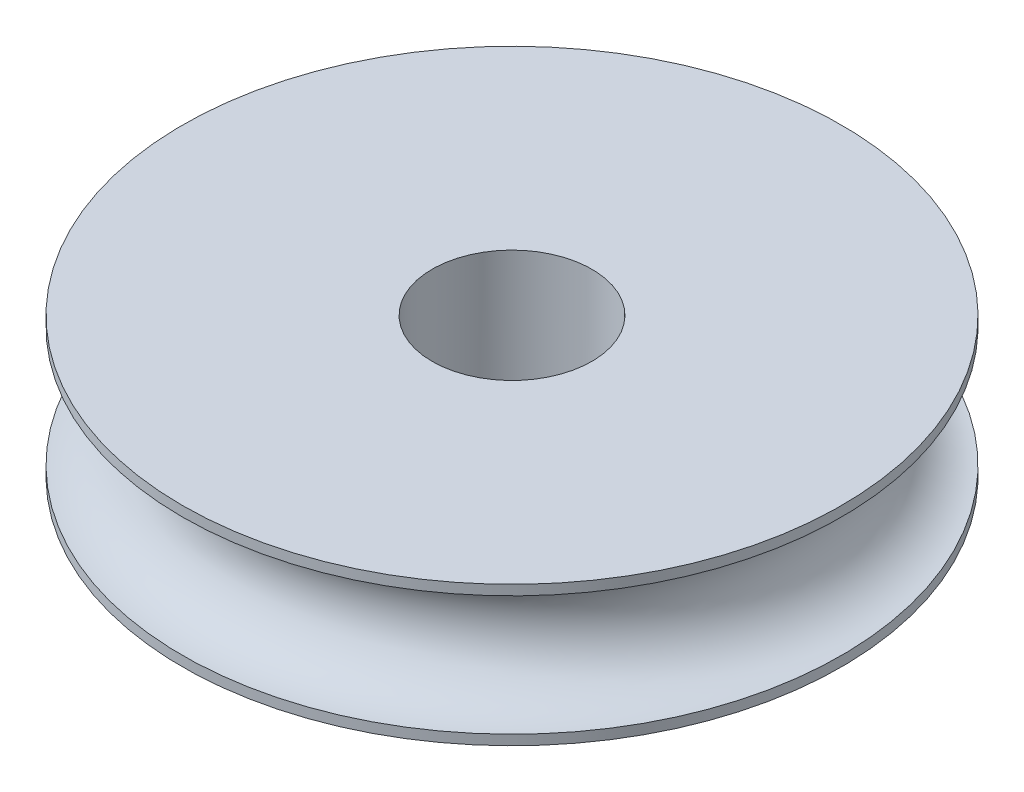
ISO-10303-21;
HEADER;
FILE_DESCRIPTION(('STEP AP214'),'2;1');
FILE_NAME('part.step','',(''),(''),'','','');
FILE_SCHEMA(('AUTOMOTIVE_DESIGN { 1 0 10303 214 1 1 1 1 }'));
ENDSEC;
DATA;
#1=APPLICATION_CONTEXT('core data for automotive mechanical design processes');
#2=APPLICATION_PROTOCOL_DEFINITION('international standard','automotive_design',2000,#1);
#3=PRODUCT_CONTEXT('',#1,'mechanical');
#4=PRODUCT('Part','Part','',(#3));
#5=PRODUCT_RELATED_PRODUCT_CATEGORY('part','',(#4));
#6=PRODUCT_DEFINITION_FORMATION('','',#4);
#7=PRODUCT_DEFINITION_CONTEXT('part definition',#1,'design');
#8=PRODUCT_DEFINITION('design','',#6,#7);
#9=PRODUCT_DEFINITION_SHAPE('','',#8);
#10=(LENGTH_UNIT() NAMED_UNIT(*) SI_UNIT(.MILLI.,.METRE.));
#11=(NAMED_UNIT(*) PLANE_ANGLE_UNIT() SI_UNIT($,.RADIAN.));
#12=(NAMED_UNIT(*) SI_UNIT($,.STERADIAN.) SOLID_ANGLE_UNIT());
#13=UNCERTAINTY_MEASURE_WITH_UNIT(LENGTH_MEASURE(1.E-05),#10,'distance_accuracy_value','');
#14=(GEOMETRIC_REPRESENTATION_CONTEXT(3) GLOBAL_UNCERTAINTY_ASSIGNED_CONTEXT((#13)) GLOBAL_UNIT_ASSIGNED_CONTEXT((#10,
#11,#12)) REPRESENTATION_CONTEXT('',''));
#15=CARTESIAN_POINT('',(0.,0.,0.));
#16=DIRECTION('',(0.,0.,1.));
#17=DIRECTION('',(1.,0.,0.));
#18=AXIS2_PLACEMENT_3D('',#15,#16,#17);
#19=CARTESIAN_POINT('',(0.,3.,0.));
#20=DIRECTION('',(0.,-1.,0.));
#21=DIRECTION('',(0.,0.,-1.));
#22=AXIS2_PLACEMENT_3D('',#19,#20,#21);
#23=TOROIDAL_SURFACE('',#22,16.5,3.);
#24=CARTESIAN_POINT('',(0.,0.,0.));
#25=DIRECTION('',(0.,-1.,0.));
#26=DIRECTION('',(0.,0.,-1.));
#27=AXIS2_PLACEMENT_3D('',#24,#25,#26);
#28=CIRCLE('',#27,16.5);
#29=CARTESIAN_POINT('',(0.,0.,-16.5));
#30=VERTEX_POINT('',#29);
#31=EDGE_CURVE('E10',#30,#30,#28,.T.);
#32=ORIENTED_EDGE('',*,*,#31,.F.);
#33=EDGE_LOOP('',(#32));
#34=FACE_BOUND('',#33,.T.);
#35=CARTESIAN_POINT('',(0.,6.,0.));
#36=DIRECTION('',(0.,1.,0.));
#37=DIRECTION('',(0.,0.,1.));
#38=AXIS2_PLACEMENT_3D('',#35,#36,#37);
#39=CIRCLE('',#38,16.5);
#40=CARTESIAN_POINT('',(0.,6.,16.5));
#41=VERTEX_POINT('',#40);
#42=EDGE_CURVE('E46',#41,#41,#39,.T.);
#43=ORIENTED_EDGE('',*,*,#42,.F.);
#44=EDGE_LOOP('',(#43));
#45=FACE_BOUND('',#44,.T.);
#46=ADVANCED_FACE('F35',(#34,#45),#23,.F.);
#47=CARTESIAN_POINT('',(0.,6.5,0.));
#48=DIRECTION('',(0.,-1.,0.));
#49=DIRECTION('',(0.,0.,-1.));
#50=AXIS2_PLACEMENT_3D('',#47,#48,#49);
#51=CYLINDRICAL_SURFACE('',#50,16.5);
#52=CARTESIAN_POINT('',(0.,6.5,0.));
#53=DIRECTION('',(0.,1.,0.));
#54=DIRECTION('',(0.,0.,1.));
#55=AXIS2_PLACEMENT_3D('',#52,#53,#54);
#56=CIRCLE('',#55,16.5);
#57=CARTESIAN_POINT('',(0.,6.5,16.5));
#58=VERTEX_POINT('',#57);
#59=EDGE_CURVE('E42',#58,#58,#56,.T.);
#60=ORIENTED_EDGE('',*,*,#59,.F.);
#61=EDGE_LOOP('',(#60));
#62=FACE_BOUND('',#61,.T.);
#63=ORIENTED_EDGE('',*,*,#42,.T.);
#64=EDGE_LOOP('',(#63));
#65=FACE_BOUND('',#64,.T.);
#66=ADVANCED_FACE('F78',(#62,#65),#51,.T.);
#67=CARTESIAN_POINT('',(0.,6.5,0.));
#68=DIRECTION('',(0.,1.,0.));
#69=DIRECTION('',(0.,0.,1.));
#70=AXIS2_PLACEMENT_3D('',#67,#68,#69);
#71=PLANE('',#70);
#72=CARTESIAN_POINT('',(0.,6.5,0.));
#73=DIRECTION('',(0.,1.,0.));
#74=DIRECTION('',(0.,0.,1.));
#75=AXIS2_PLACEMENT_3D('',#72,#73,#74);
#76=CIRCLE('',#75,4.);
#77=CARTESIAN_POINT('',(0.,6.5,4.));
#78=VERTEX_POINT('',#77);
#79=EDGE_CURVE('E54',#78,#78,#76,.T.);
#80=ORIENTED_EDGE('',*,*,#79,.F.);
#81=EDGE_LOOP('',(#80));
#82=FACE_BOUND('',#81,.T.);
#83=ORIENTED_EDGE('',*,*,#59,.T.);
#84=EDGE_LOOP('',(#83));
#85=FACE_BOUND('',#84,.T.);
#86=ADVANCED_FACE('F71',(#82,#85),#71,.T.);
#87=CARTESIAN_POINT('',(0.,-0.5,0.));
#88=DIRECTION('',(0.,1.,0.));
#89=DIRECTION('',(0.,0.,1.));
#90=AXIS2_PLACEMENT_3D('',#87,#88,#89);
#91=CYLINDRICAL_SURFACE('',#90,16.5);
#92=CARTESIAN_POINT('',(0.,-0.5,0.));
#93=DIRECTION('',(0.,-1.,0.));
#94=DIRECTION('',(0.,0.,-1.));
#95=AXIS2_PLACEMENT_3D('',#92,#93,#94);
#96=CIRCLE('',#95,16.5);
#97=CARTESIAN_POINT('',(0.,-0.5,-16.5));
#98=VERTEX_POINT('',#97);
#99=EDGE_CURVE('E50',#98,#98,#96,.T.);
#100=ORIENTED_EDGE('',*,*,#99,.F.);
#101=EDGE_LOOP('',(#100));
#102=FACE_BOUND('',#101,.T.);
#103=ORIENTED_EDGE('',*,*,#31,.T.);
#104=EDGE_LOOP('',(#103));
#105=FACE_BOUND('',#104,.T.);
#106=ADVANCED_FACE('F66',(#102,#105),#91,.T.);
#107=CARTESIAN_POINT('',(0.,-0.5,0.));
#108=DIRECTION('',(0.,-1.,0.));
#109=DIRECTION('',(0.,0.,-1.));
#110=AXIS2_PLACEMENT_3D('',#107,#108,#109);
#111=PLANE('',#110);
#112=CARTESIAN_POINT('',(0.,-0.5,0.));
#113=DIRECTION('',(0.,-1.,0.));
#114=DIRECTION('',(0.,0.,-1.));
#115=AXIS2_PLACEMENT_3D('',#112,#113,#114);
#116=CIRCLE('',#115,4.);
#117=CARTESIAN_POINT('',(0.,-0.5,-4.));
#118=VERTEX_POINT('',#117);
#119=EDGE_CURVE('E38',#118,#118,#116,.T.);
#120=ORIENTED_EDGE('',*,*,#119,.F.);
#121=EDGE_LOOP('',(#120));
#122=FACE_BOUND('',#121,.T.);
#123=ORIENTED_EDGE('',*,*,#99,.T.);
#124=EDGE_LOOP('',(#123));
#125=FACE_BOUND('',#124,.T.);
#126=ADVANCED_FACE('F63',(#122,#125),#111,.T.);
#127=CARTESIAN_POINT('',(0.,-3.5,0.));
#128=DIRECTION('',(0.,1.,0.));
#129=DIRECTION('',(0.,0.,1.));
#130=AXIS2_PLACEMENT_3D('',#127,#128,#129);
#131=CYLINDRICAL_SURFACE('',#130,4.);
#132=ORIENTED_EDGE('',*,*,#119,.T.);
#133=EDGE_LOOP('',(#132));
#134=FACE_BOUND('',#133,.T.);
#135=ORIENTED_EDGE('',*,*,#79,.T.);
#136=EDGE_LOOP('',(#135));
#137=FACE_BOUND('',#136,.T.);
#138=ADVANCED_FACE('F61',(#134,#137),#131,.F.);
#139=CLOSED_SHELL('',(#46,#66,#86,#106,#126,#138));
#140=MANIFOLD_SOLID_BREP('B2',#139);
#141=ADVANCED_BREP_SHAPE_REPRESENTATION('',(#18,#140),#14);
#142=SHAPE_DEFINITION_REPRESENTATION(#9,#141);
ENDSEC;
END-ISO-10303-21;
